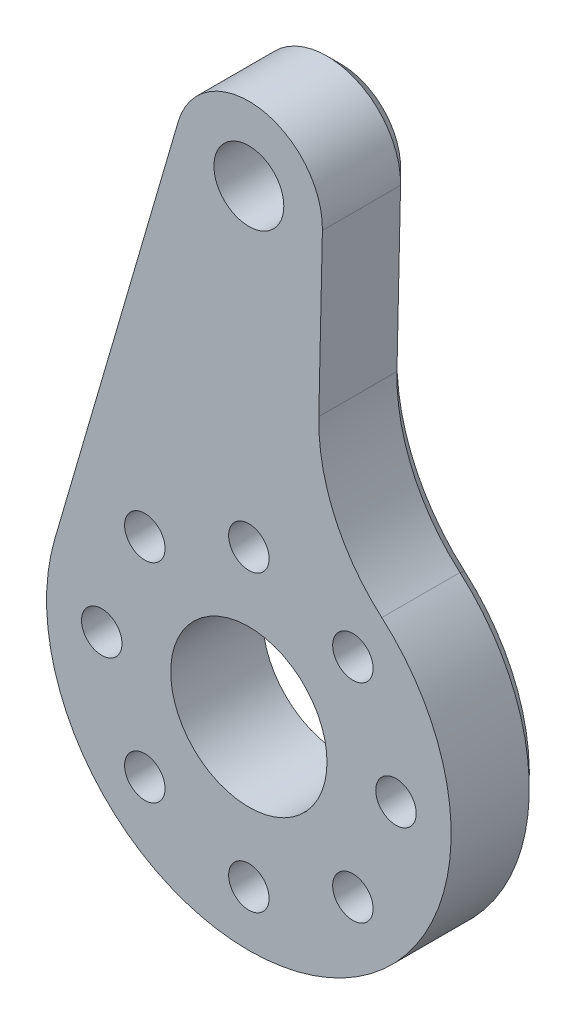
ISO-10303-21;
HEADER;
FILE_DESCRIPTION(('STEP AP214'),'2;1');
FILE_NAME('part.step','',(''),(''),'','','');
FILE_SCHEMA(('AUTOMOTIVE_DESIGN { 1 0 10303 214 1 1 1 1 }'));
ENDSEC;
DATA;
#1=APPLICATION_CONTEXT('core data for automotive mechanical design processes');
#2=APPLICATION_PROTOCOL_DEFINITION('international standard','automotive_design',2000,#1);
#3=PRODUCT_CONTEXT('',#1,'mechanical');
#4=PRODUCT('Part','Part','',(#3));
#5=PRODUCT_RELATED_PRODUCT_CATEGORY('part','',(#4));
#6=PRODUCT_DEFINITION_FORMATION('','',#4);
#7=PRODUCT_DEFINITION_CONTEXT('part definition',#1,'design');
#8=PRODUCT_DEFINITION('design','',#6,#7);
#9=PRODUCT_DEFINITION_SHAPE('','',#8);
#10=(LENGTH_UNIT() NAMED_UNIT(*) SI_UNIT(.MILLI.,.METRE.));
#11=(NAMED_UNIT(*) PLANE_ANGLE_UNIT() SI_UNIT($,.RADIAN.));
#12=(NAMED_UNIT(*) SI_UNIT($,.STERADIAN.) SOLID_ANGLE_UNIT());
#13=UNCERTAINTY_MEASURE_WITH_UNIT(LENGTH_MEASURE(1.E-05),#10,'distance_accuracy_value','');
#14=(GEOMETRIC_REPRESENTATION_CONTEXT(3) GLOBAL_UNCERTAINTY_ASSIGNED_CONTEXT((#13)) GLOBAL_UNIT_ASSIGNED_CONTEXT((#10,
#11,#12)) REPRESENTATION_CONTEXT('',''));
#15=CARTESIAN_POINT('',(0.,0.,0.));
#16=DIRECTION('',(0.,0.,1.));
#17=DIRECTION('',(1.,0.,0.));
#18=AXIS2_PLACEMENT_3D('',#15,#16,#17);
#19=CARTESIAN_POINT('',(-6.71811127656901,-21.5039036018759,5.));
#20=DIRECTION('',(0.,0.,-1.));
#21=DIRECTION('',(-1.,0.,0.));
#22=AXIS2_PLACEMENT_3D('',#19,#20,#21);
#23=CYLINDRICAL_SURFACE('',#22,1.1);
#24=CARTESIAN_POINT('',(-6.71811127656901,-21.5039036018759,5.));
#25=DIRECTION('',(0.,0.,1.));
#26=DIRECTION('',(1.,0.,0.));
#27=AXIS2_PLACEMENT_3D('',#24,#25,#26);
#28=CIRCLE('',#27,1.1);
#29=CARTESIAN_POINT('',(-5.61811127656901,-21.5039036018759,5.));
#30=VERTEX_POINT('',#29);
#31=EDGE_CURVE('E229',#30,#30,#28,.T.);
#32=ORIENTED_EDGE('',*,*,#31,.T.);
#33=EDGE_LOOP('',(#32));
#34=FACE_BOUND('',#33,.T.);
#35=CARTESIAN_POINT('',(-6.71811127656901,-21.5039036018759,2.25));
#36=DIRECTION('',(0.,0.,-1.));
#37=DIRECTION('',(-1.,0.,0.));
#38=AXIS2_PLACEMENT_3D('',#35,#36,#37);
#39=CIRCLE('',#38,1.1);
#40=CARTESIAN_POINT('',(-7.81811127656901,-21.5039036018759,2.25));
#41=VERTEX_POINT('',#40);
#42=EDGE_CURVE('E205',#41,#41,#39,.T.);
#43=ORIENTED_EDGE('',*,*,#42,.T.);
#44=EDGE_LOOP('',(#43));
#45=FACE_BOUND('',#44,.T.);
#46=ADVANCED_FACE('F41',(#34,#45),#23,.F.);
#47=CARTESIAN_POINT('',(-9.06125702707663,-27.1607578513683,5.));
#48=DIRECTION('',(0.,0.,-1.));
#49=DIRECTION('',(-1.,0.,0.));
#50=AXIS2_PLACEMENT_3D('',#47,#48,#49);
#51=CYLINDRICAL_SURFACE('',#50,1.1);
#52=CARTESIAN_POINT('',(-9.06125702707663,-27.1607578513683,5.));
#53=DIRECTION('',(0.,0.,1.));
#54=DIRECTION('',(1.,0.,0.));
#55=AXIS2_PLACEMENT_3D('',#52,#53,#54);
#56=CIRCLE('',#55,1.1);
#57=CARTESIAN_POINT('',(-7.96125702707663,-27.1607578513683,5.));
#58=VERTEX_POINT('',#57);
#59=EDGE_CURVE('E225',#58,#58,#56,.T.);
#60=ORIENTED_EDGE('',*,*,#59,.T.);
#61=EDGE_LOOP('',(#60));
#62=FACE_BOUND('',#61,.T.);
#63=CARTESIAN_POINT('',(-9.06125702707663,-27.1607578513683,2.25));
#64=DIRECTION('',(0.,0.,-1.));
#65=DIRECTION('',(-1.,0.,0.));
#66=AXIS2_PLACEMENT_3D('',#63,#64,#65);
#67=CIRCLE('',#66,1.1);
#68=CARTESIAN_POINT('',(-10.1612570270766,-27.1607578513683,2.25));
#69=VERTEX_POINT('',#68);
#70=EDGE_CURVE('E282',#69,#69,#67,.T.);
#71=ORIENTED_EDGE('',*,*,#70,.T.);
#72=EDGE_LOOP('',(#71));
#73=FACE_BOUND('',#72,.T.);
#74=ADVANCED_FACE('F404',(#62,#73),#51,.F.);
#75=CARTESIAN_POINT('',(-14.718111276569,-29.5039036018759,5.));
#76=DIRECTION('',(0.,0.,-1.));
#77=DIRECTION('',(-1.,0.,0.));
#78=AXIS2_PLACEMENT_3D('',#75,#76,#77);
#79=CYLINDRICAL_SURFACE('',#78,1.1);
#80=CARTESIAN_POINT('',(-14.718111276569,-29.5039036018759,5.));
#81=DIRECTION('',(0.,0.,1.));
#82=DIRECTION('',(1.,0.,0.));
#83=AXIS2_PLACEMENT_3D('',#80,#81,#82);
#84=CIRCLE('',#83,1.1);
#85=CARTESIAN_POINT('',(-13.618111276569,-29.5039036018759,5.));
#86=VERTEX_POINT('',#85);
#87=EDGE_CURVE('E221',#86,#86,#84,.T.);
#88=ORIENTED_EDGE('',*,*,#87,.T.);
#89=EDGE_LOOP('',(#88));
#90=FACE_BOUND('',#89,.T.);
#91=CARTESIAN_POINT('',(-14.718111276569,-29.5039036018759,2.25));
#92=DIRECTION('',(0.,0.,-1.));
#93=DIRECTION('',(-1.,0.,0.));
#94=AXIS2_PLACEMENT_3D('',#91,#92,#93);
#95=CIRCLE('',#94,1.1);
#96=CARTESIAN_POINT('',(-15.818111276569,-29.5039036018759,2.25));
#97=VERTEX_POINT('',#96);
#98=EDGE_CURVE('E278',#97,#97,#95,.T.);
#99=ORIENTED_EDGE('',*,*,#98,.T.);
#100=EDGE_LOOP('',(#99));
#101=FACE_BOUND('',#100,.T.);
#102=ADVANCED_FACE('F409',(#90,#101),#79,.F.);
#103=CARTESIAN_POINT('',(-20.3749655260614,-27.1607578513683,5.));
#104=DIRECTION('',(0.,0.,-1.));
#105=DIRECTION('',(-1.,0.,0.));
#106=AXIS2_PLACEMENT_3D('',#103,#104,#105);
#107=CYLINDRICAL_SURFACE('',#106,1.1);
#108=CARTESIAN_POINT('',(-20.3749655260614,-27.1607578513683,5.));
#109=DIRECTION('',(0.,0.,1.));
#110=DIRECTION('',(1.,0.,0.));
#111=AXIS2_PLACEMENT_3D('',#108,#109,#110);
#112=CIRCLE('',#111,1.1);
#113=CARTESIAN_POINT('',(-19.2749655260614,-27.1607578513683,5.));
#114=VERTEX_POINT('',#113);
#115=EDGE_CURVE('E217',#114,#114,#112,.T.);
#116=ORIENTED_EDGE('',*,*,#115,.T.);
#117=EDGE_LOOP('',(#116));
#118=FACE_BOUND('',#117,.T.);
#119=CARTESIAN_POINT('',(-20.3749655260614,-27.1607578513683,2.25));
#120=DIRECTION('',(0.,0.,-1.));
#121=DIRECTION('',(-1.,0.,0.));
#122=AXIS2_PLACEMENT_3D('',#119,#120,#121);
#123=CIRCLE('',#122,1.1);
#124=CARTESIAN_POINT('',(-21.4749655260614,-27.1607578513683,2.25));
#125=VERTEX_POINT('',#124);
#126=EDGE_CURVE('E274',#125,#125,#123,.T.);
#127=ORIENTED_EDGE('',*,*,#126,.T.);
#128=EDGE_LOOP('',(#127));
#129=FACE_BOUND('',#128,.T.);
#130=ADVANCED_FACE('F416',(#118,#129),#107,.F.);
#131=CARTESIAN_POINT('',(-22.718111276569,-21.5039036018759,5.));
#132=DIRECTION('',(0.,0.,-1.));
#133=DIRECTION('',(-1.,0.,0.));
#134=AXIS2_PLACEMENT_3D('',#131,#132,#133);
#135=CYLINDRICAL_SURFACE('',#134,1.1);
#136=CARTESIAN_POINT('',(-22.718111276569,-21.5039036018759,5.));
#137=DIRECTION('',(0.,0.,1.));
#138=DIRECTION('',(1.,0.,0.));
#139=AXIS2_PLACEMENT_3D('',#136,#137,#138);
#140=CIRCLE('',#139,1.1);
#141=CARTESIAN_POINT('',(-21.618111276569,-21.5039036018759,5.));
#142=VERTEX_POINT('',#141);
#143=EDGE_CURVE('E213',#142,#142,#140,.T.);
#144=ORIENTED_EDGE('',*,*,#143,.T.);
#145=EDGE_LOOP('',(#144));
#146=FACE_BOUND('',#145,.T.);
#147=CARTESIAN_POINT('',(-22.718111276569,-21.5039036018759,2.25));
#148=DIRECTION('',(0.,0.,-1.));
#149=DIRECTION('',(-1.,0.,0.));
#150=AXIS2_PLACEMENT_3D('',#147,#148,#149);
#151=CIRCLE('',#150,1.1);
#152=CARTESIAN_POINT('',(-23.818111276569,-21.5039036018759,2.25));
#153=VERTEX_POINT('',#152);
#154=EDGE_CURVE('E270',#153,#153,#151,.T.);
#155=ORIENTED_EDGE('',*,*,#154,.T.);
#156=EDGE_LOOP('',(#155));
#157=FACE_BOUND('',#156,.T.);
#158=ADVANCED_FACE('F420',(#146,#157),#135,.F.);
#159=CARTESIAN_POINT('',(-20.3749655260614,-15.8470493523836,5.));
#160=DIRECTION('',(0.,0.,-1.));
#161=DIRECTION('',(-1.,0.,0.));
#162=AXIS2_PLACEMENT_3D('',#159,#160,#161);
#163=CYLINDRICAL_SURFACE('',#162,1.1);
#164=CARTESIAN_POINT('',(-20.3749655260614,-15.8470493523836,5.));
#165=DIRECTION('',(0.,0.,1.));
#166=DIRECTION('',(1.,0.,0.));
#167=AXIS2_PLACEMENT_3D('',#164,#165,#166);
#168=CIRCLE('',#167,1.1);
#169=CARTESIAN_POINT('',(-19.2749655260614,-15.8470493523836,5.));
#170=VERTEX_POINT('',#169);
#171=EDGE_CURVE('E209',#170,#170,#168,.T.);
#172=ORIENTED_EDGE('',*,*,#171,.T.);
#173=EDGE_LOOP('',(#172));
#174=FACE_BOUND('',#173,.T.);
#175=CARTESIAN_POINT('',(-20.3749655260614,-15.8470493523836,2.25));
#176=DIRECTION('',(0.,0.,-1.));
#177=DIRECTION('',(-1.,0.,0.));
#178=AXIS2_PLACEMENT_3D('',#175,#176,#177);
#179=CIRCLE('',#178,1.1);
#180=CARTESIAN_POINT('',(-21.4749655260614,-15.8470493523836,2.25));
#181=VERTEX_POINT('',#180);
#182=EDGE_CURVE('E266',#181,#181,#179,.T.);
#183=ORIENTED_EDGE('',*,*,#182,.T.);
#184=EDGE_LOOP('',(#183));
#185=FACE_BOUND('',#184,.T.);
#186=ADVANCED_FACE('F424',(#174,#185),#163,.F.);
#187=CARTESIAN_POINT('',(-14.718111276569,-13.5039036018759,5.));
#188=DIRECTION('',(0.,0.,-1.));
#189=DIRECTION('',(-1.,0.,0.));
#190=AXIS2_PLACEMENT_3D('',#187,#188,#189);
#191=CYLINDRICAL_SURFACE('',#190,1.1);
#192=CARTESIAN_POINT('',(-14.718111276569,-13.5039036018759,5.));
#193=DIRECTION('',(0.,0.,1.));
#194=DIRECTION('',(1.,0.,0.));
#195=AXIS2_PLACEMENT_3D('',#192,#193,#194);
#196=CIRCLE('',#195,1.1);
#197=CARTESIAN_POINT('',(-13.618111276569,-13.5039036018759,5.));
#198=VERTEX_POINT('',#197);
#199=EDGE_CURVE('E204',#198,#198,#196,.T.);
#200=ORIENTED_EDGE('',*,*,#199,.T.);
#201=EDGE_LOOP('',(#200));
#202=FACE_BOUND('',#201,.T.);
#203=CARTESIAN_POINT('',(-14.718111276569,-13.5039036018759,2.25));
#204=DIRECTION('',(0.,0.,-1.));
#205=DIRECTION('',(-1.,0.,0.));
#206=AXIS2_PLACEMENT_3D('',#203,#204,#205);
#207=CIRCLE('',#206,1.1);
#208=CARTESIAN_POINT('',(-15.818111276569,-13.5039036018759,2.25));
#209=VERTEX_POINT('',#208);
#210=EDGE_CURVE('E262',#209,#209,#207,.T.);
#211=ORIENTED_EDGE('',*,*,#210,.T.);
#212=EDGE_LOOP('',(#211));
#213=FACE_BOUND('',#212,.T.);
#214=ADVANCED_FACE('F428',(#202,#213),#191,.F.);
#215=CARTESIAN_POINT('',(-9.06125702707664,-15.8470493523836,5.));
#216=DIRECTION('',(0.,0.,-1.));
#217=DIRECTION('',(-1.,0.,0.));
#218=AXIS2_PLACEMENT_3D('',#215,#216,#217);
#219=CYLINDRICAL_SURFACE('',#218,1.1);
#220=CARTESIAN_POINT('',(-9.06125702707664,-15.8470493523836,5.));
#221=DIRECTION('',(0.,0.,1.));
#222=DIRECTION('',(1.,0.,0.));
#223=AXIS2_PLACEMENT_3D('',#220,#221,#222);
#224=CIRCLE('',#223,1.1);
#225=CARTESIAN_POINT('',(-7.96125702707664,-15.8470493523836,5.));
#226=VERTEX_POINT('',#225);
#227=EDGE_CURVE('E200',#226,#226,#224,.T.);
#228=ORIENTED_EDGE('',*,*,#227,.T.);
#229=EDGE_LOOP('',(#228));
#230=FACE_BOUND('',#229,.T.);
#231=CARTESIAN_POINT('',(-9.06125702707664,-15.8470493523836,2.25));
#232=DIRECTION('',(0.,0.,-1.));
#233=DIRECTION('',(-1.,0.,0.));
#234=AXIS2_PLACEMENT_3D('',#231,#232,#233);
#235=CIRCLE('',#234,1.1);
#236=CARTESIAN_POINT('',(-10.1612570270766,-15.8470493523836,2.25));
#237=VERTEX_POINT('',#236);
#238=EDGE_CURVE('E196',#237,#237,#235,.T.);
#239=ORIENTED_EDGE('',*,*,#238,.T.);
#240=EDGE_LOOP('',(#239));
#241=FACE_BOUND('',#240,.T.);
#242=ADVANCED_FACE('F432',(#230,#241),#219,.F.);
#243=CARTESIAN_POINT('',(-14.718111276569,3.49609639812407,5.));
#244=DIRECTION('',(0.,0.,1.));
#245=DIRECTION('',(1.,0.,0.));
#246=AXIS2_PLACEMENT_3D('',#243,#244,#245);
#247=PLANE('',#246);
#248=DIRECTION('',(-0.0219929480625186,-0.999758125866211,0.));
#249=VECTOR('',#248,1.);
#250=CARTESIAN_POINT('',(-10.7190787731042,3.40812460587399,5.));
#251=LINE('',#250,#249);
#252=CARTESIAN_POINT('',(-10.7190787731042,3.40812460587399,5.));
#253=VERTEX_POINT('',#252);
#254=CARTESIAN_POINT('',(-10.9140806022467,-5.45629241952004,5.));
#255=VERTEX_POINT('',#254);
#256=EDGE_CURVE('E121',#253,#255,#251,.T.);
#257=ORIENTED_EDGE('',*,*,#256,.F.);
#258=CARTESIAN_POINT('',(-14.718111276569,3.49609639812407,5.));
#259=DIRECTION('',(0.,0.,1.));
#260=DIRECTION('',(1.,0.,0.));
#261=AXIS2_PLACEMENT_3D('',#258,#259,#260);
#262=CIRCLE('',#261,4.);
#263=CARTESIAN_POINT('',(-18.558111276569,4.61609639812407,5.));
#264=VERTEX_POINT('',#263);
#265=EDGE_CURVE('E105',#253,#264,#262,.T.);
#266=ORIENTED_EDGE('',*,*,#265,.T.);
#267=DIRECTION('',(-0.28,-0.96,0.));
#268=VECTOR('',#267,1.);
#269=CARTESIAN_POINT('',(-18.558111276569,4.61609639812407,5.));
#270=LINE('',#269,#268);
#271=CARTESIAN_POINT('',(-25.278111276569,-18.4239036018759,5.));
#272=VERTEX_POINT('',#271);
#273=EDGE_CURVE('E113',#264,#272,#270,.T.);
#274=ORIENTED_EDGE('',*,*,#273,.T.);
#275=CARTESIAN_POINT('',(-14.718111276569,-21.5039036018759,5.));
#276=DIRECTION('',(0.,0.,1.));
#277=DIRECTION('',(1.,0.,0.));
#278=AXIS2_PLACEMENT_3D('',#275,#276,#277);
#279=CIRCLE('',#278,11.);
#280=CARTESIAN_POINT('',(-7.48869550214859,-13.2132131866837,5.));
#281=VERTEX_POINT('',#280);
#282=EDGE_CURVE('E250',#272,#281,#279,.T.);
#283=ORIENTED_EDGE('',*,*,#282,.T.);
#284=CARTESIAN_POINT('',(-0.916499343584562,-5.67622190014523,5.));
#285=DIRECTION('',(0.,0.,1.));
#286=DIRECTION('',(1.,0.,0.));
#287=AXIS2_PLACEMENT_3D('',#284,#285,#286);
#288=CIRCLE('',#287,10.);
#289=EDGE_CURVE('E131',#281,#255,#288,.F.);
#290=ORIENTED_EDGE('',*,*,#289,.T.);
#291=EDGE_LOOP('',(#257,#266,#274,#283,#290));
#292=FACE_BOUND('',#291,.T.);
#293=ORIENTED_EDGE('',*,*,#199,.F.);
#294=EDGE_LOOP('',(#293));
#295=FACE_BOUND('',#294,.T.);
#296=ORIENTED_EDGE('',*,*,#143,.F.);
#297=EDGE_LOOP('',(#296));
#298=FACE_BOUND('',#297,.T.);
#299=ORIENTED_EDGE('',*,*,#87,.F.);
#300=EDGE_LOOP('',(#299));
#301=FACE_BOUND('',#300,.T.);
#302=ORIENTED_EDGE('',*,*,#31,.F.);
#303=EDGE_LOOP('',(#302));
#304=FACE_BOUND('',#303,.T.);
#305=CARTESIAN_POINT('',(-14.718111276569,3.49609639812407,5.));
#306=DIRECTION('',(0.,0.,1.));
#307=DIRECTION('',(1.,0.,0.));
#308=AXIS2_PLACEMENT_3D('',#305,#306,#307);
#309=CIRCLE('',#308,1.9);
#310=CARTESIAN_POINT('',(-12.818111276569,3.49609639812407,5.));
#311=VERTEX_POINT('',#310);
#312=EDGE_CURVE('E114',#311,#311,#309,.T.);
#313=ORIENTED_EDGE('',*,*,#312,.F.);
#314=EDGE_LOOP('',(#313));
#315=FACE_BOUND('',#314,.T.);
#316=CARTESIAN_POINT('',(-14.718111276569,-21.5039036018759,5.));
#317=DIRECTION('',(0.,0.,1.));
#318=DIRECTION('',(1.,0.,0.));
#319=AXIS2_PLACEMENT_3D('',#316,#317,#318);
#320=CIRCLE('',#319,4.25);
#321=CARTESIAN_POINT('',(-10.468111276569,-21.5039036018759,5.));
#322=VERTEX_POINT('',#321);
#323=EDGE_CURVE('E234',#322,#322,#320,.T.);
#324=ORIENTED_EDGE('',*,*,#323,.F.);
#325=EDGE_LOOP('',(#324));
#326=FACE_BOUND('',#325,.T.);
#327=ORIENTED_EDGE('',*,*,#59,.F.);
#328=EDGE_LOOP('',(#327));
#329=FACE_BOUND('',#328,.T.);
#330=ORIENTED_EDGE('',*,*,#115,.F.);
#331=EDGE_LOOP('',(#330));
#332=FACE_BOUND('',#331,.T.);
#333=ORIENTED_EDGE('',*,*,#171,.F.);
#334=EDGE_LOOP('',(#333));
#335=FACE_BOUND('',#334,.T.);
#336=ORIENTED_EDGE('',*,*,#227,.F.);
#337=EDGE_LOOP('',(#336));
#338=FACE_BOUND('',#337,.T.);
#339=ADVANCED_FACE('F127',(#292,#295,#298,#301,#304,#315,#326,#329,#332,#335,#338),#247,.T.);
#340=CARTESIAN_POINT('',(-14.718111276569,3.49609639812407,0.));
#341=DIRECTION('',(0.,0.,1.));
#342=DIRECTION('',(1.,0.,0.));
#343=AXIS2_PLACEMENT_3D('',#340,#341,#342);
#344=PLANE('',#343);
#345=CARTESIAN_POINT('',(-14.718111276569,3.49609639812407,0.));
#346=DIRECTION('',(0.,0.,1.));
#347=DIRECTION('',(1.,0.,0.));
#348=AXIS2_PLACEMENT_3D('',#345,#346,#347);
#349=CIRCLE('',#348,3.25);
#350=CARTESIAN_POINT('',(-17.838111276569,4.40609639812407,0.));
#351=VERTEX_POINT('',#350);
#352=CARTESIAN_POINT('',(-11.4688973675038,3.42461931692088,0.));
#353=VERTEX_POINT('',#352);
#354=EDGE_CURVE('E304',#351,#353,#349,.F.);
#355=ORIENTED_EDGE('',*,*,#354,.T.);
#356=DIRECTION('',(-0.0219929480625186,-0.999758125866211,0.));
#357=VECTOR('',#356,1.);
#358=CARTESIAN_POINT('',(-11.4688973675038,3.42461931692088,0.));
#359=LINE('',#358,#357);
#360=CARTESIAN_POINT('',(-11.6638991966463,-5.43979770847315,0.));
#361=VERTEX_POINT('',#360);
#362=EDGE_CURVE('E310',#353,#361,#359,.T.);
#363=ORIENTED_EDGE('',*,*,#362,.T.);
#364=CARTESIAN_POINT('',(-0.916499343584562,-5.67622190014523,0.));
#365=DIRECTION('',(0.,0.,1.));
#366=DIRECTION('',(1.,0.,0.));
#367=AXIS2_PLACEMENT_3D('',#364,#365,#366);
#368=CIRCLE('',#367,10.75);
#369=CARTESIAN_POINT('',(-7.98161021404089,-13.778487533174,0.));
#370=VERTEX_POINT('',#369);
#371=EDGE_CURVE('E307',#361,#370,#368,.T.);
#372=ORIENTED_EDGE('',*,*,#371,.T.);
#373=CARTESIAN_POINT('',(-14.718111276569,-21.5039036018759,0.));
#374=DIRECTION('',(0.,0.,1.));
#375=DIRECTION('',(1.,0.,0.));
#376=AXIS2_PLACEMENT_3D('',#373,#374,#375);
#377=CIRCLE('',#376,10.25);
#378=CARTESIAN_POINT('',(-24.558111276569,-18.6339036018759,0.));
#379=VERTEX_POINT('',#378);
#380=EDGE_CURVE('E301',#370,#379,#377,.F.);
#381=ORIENTED_EDGE('',*,*,#380,.T.);
#382=DIRECTION('',(0.28,0.96,0.));
#383=VECTOR('',#382,1.);
#384=CARTESIAN_POINT('',(-17.838111276569,4.40609639812407,0.));
#385=LINE('',#384,#383);
#386=EDGE_CURVE('E298',#379,#351,#385,.T.);
#387=ORIENTED_EDGE('',*,*,#386,.T.);
#388=EDGE_LOOP('',(#355,#363,#372,#381,#387));
#389=FACE_BOUND('',#388,.T.);
#390=CARTESIAN_POINT('',(-20.3749655260614,-15.8470493523836,0.));
#391=DIRECTION('',(0.,0.,-1.));
#392=DIRECTION('',(-1.,0.,0.));
#393=AXIS2_PLACEMENT_3D('',#390,#391,#392);
#394=CIRCLE('',#393,1.75);
#395=CARTESIAN_POINT('',(-22.1249655260614,-15.8470493523836,0.));
#396=VERTEX_POINT('',#395);
#397=EDGE_CURVE('E133',#396,#396,#394,.T.);
#398=ORIENTED_EDGE('',*,*,#397,.F.);
#399=EDGE_LOOP('',(#398));
#400=FACE_BOUND('',#399,.T.);
#401=CARTESIAN_POINT('',(-14.718111276569,-13.5039036018759,0.));
#402=DIRECTION('',(0.,0.,-1.));
#403=DIRECTION('',(-1.,0.,0.));
#404=AXIS2_PLACEMENT_3D('',#401,#402,#403);
#405=CIRCLE('',#404,1.75);
#406=CARTESIAN_POINT('',(-16.468111276569,-13.5039036018759,0.));
#407=VERTEX_POINT('',#406);
#408=EDGE_CURVE('E185',#407,#407,#405,.T.);
#409=ORIENTED_EDGE('',*,*,#408,.F.);
#410=EDGE_LOOP('',(#409));
#411=FACE_BOUND('',#410,.T.);
#412=CARTESIAN_POINT('',(-9.06125702707664,-15.8470493523836,0.));
#413=DIRECTION('',(0.,0.,-1.));
#414=DIRECTION('',(-1.,0.,0.));
#415=AXIS2_PLACEMENT_3D('',#412,#413,#414);
#416=CIRCLE('',#415,1.75);
#417=CARTESIAN_POINT('',(-10.8112570270766,-15.8470493523836,0.));
#418=VERTEX_POINT('',#417);
#419=EDGE_CURVE('E177',#418,#418,#416,.T.);
#420=ORIENTED_EDGE('',*,*,#419,.F.);
#421=EDGE_LOOP('',(#420));
#422=FACE_BOUND('',#421,.T.);
#423=CARTESIAN_POINT('',(-6.71811127656902,-21.5039036018759,0.));
#424=DIRECTION('',(0.,0.,-1.));
#425=DIRECTION('',(-1.,0.,0.));
#426=AXIS2_PLACEMENT_3D('',#423,#424,#425);
#427=CIRCLE('',#426,1.75);
#428=CARTESIAN_POINT('',(-8.46811127656902,-21.5039036018759,0.));
#429=VERTEX_POINT('',#428);
#430=EDGE_CURVE('E169',#429,#429,#427,.T.);
#431=ORIENTED_EDGE('',*,*,#430,.F.);
#432=EDGE_LOOP('',(#431));
#433=FACE_BOUND('',#432,.T.);
#434=CARTESIAN_POINT('',(-9.06125702707664,-27.1607578513683,0.));
#435=DIRECTION('',(0.,0.,-1.));
#436=DIRECTION('',(-1.,0.,0.));
#437=AXIS2_PLACEMENT_3D('',#434,#435,#436);
#438=CIRCLE('',#437,1.75);
#439=CARTESIAN_POINT('',(-10.8112570270766,-27.1607578513683,0.));
#440=VERTEX_POINT('',#439);
#441=EDGE_CURVE('E161',#440,#440,#438,.T.);
#442=ORIENTED_EDGE('',*,*,#441,.F.);
#443=EDGE_LOOP('',(#442));
#444=FACE_BOUND('',#443,.T.);
#445=CARTESIAN_POINT('',(-14.718111276569,-29.5039036018759,0.));
#446=DIRECTION('',(0.,0.,-1.));
#447=DIRECTION('',(-1.,0.,0.));
#448=AXIS2_PLACEMENT_3D('',#445,#446,#447);
#449=CIRCLE('',#448,1.75);
#450=CARTESIAN_POINT('',(-16.468111276569,-29.5039036018759,0.));
#451=VERTEX_POINT('',#450);
#452=EDGE_CURVE('E153',#451,#451,#449,.T.);
#453=ORIENTED_EDGE('',*,*,#452,.F.);
#454=EDGE_LOOP('',(#453));
#455=FACE_BOUND('',#454,.T.);
#456=CARTESIAN_POINT('',(-20.3749655260614,-27.1607578513683,0.));
#457=DIRECTION('',(0.,0.,-1.));
#458=DIRECTION('',(-1.,0.,0.));
#459=AXIS2_PLACEMENT_3D('',#456,#457,#458);
#460=CIRCLE('',#459,1.74999999999999);
#461=CARTESIAN_POINT('',(-22.1249655260614,-27.1607578513683,0.));
#462=VERTEX_POINT('',#461);
#463=EDGE_CURVE('E145',#462,#462,#460,.T.);
#464=ORIENTED_EDGE('',*,*,#463,.F.);
#465=EDGE_LOOP('',(#464));
#466=FACE_BOUND('',#465,.T.);
#467=CARTESIAN_POINT('',(-22.718111276569,-21.5039036018759,0.));
#468=DIRECTION('',(0.,0.,-1.));
#469=DIRECTION('',(-1.,0.,0.));
#470=AXIS2_PLACEMENT_3D('',#467,#468,#469);
#471=CIRCLE('',#470,1.75);
#472=CARTESIAN_POINT('',(-24.468111276569,-21.5039036018759,0.));
#473=VERTEX_POINT('',#472);
#474=EDGE_CURVE('E144',#473,#473,#471,.T.);
#475=ORIENTED_EDGE('',*,*,#474,.F.);
#476=EDGE_LOOP('',(#475));
#477=FACE_BOUND('',#476,.T.);
#478=CARTESIAN_POINT('',(-14.718111276569,3.49609639812407,0.));
#479=DIRECTION('',(0.,0.,1.));
#480=DIRECTION('',(1.,0.,0.));
#481=AXIS2_PLACEMENT_3D('',#478,#479,#480);
#482=CIRCLE('',#481,1.9);
#483=CARTESIAN_POINT('',(-12.818111276569,3.49609639812407,0.));
#484=VERTEX_POINT('',#483);
#485=EDGE_CURVE('E238',#484,#484,#482,.T.);
#486=ORIENTED_EDGE('',*,*,#485,.T.);
#487=EDGE_LOOP('',(#486));
#488=FACE_BOUND('',#487,.T.);
#489=CARTESIAN_POINT('',(-14.718111276569,-21.5039036018759,0.));
#490=DIRECTION('',(0.,0.,1.));
#491=DIRECTION('',(1.,0.,0.));
#492=AXIS2_PLACEMENT_3D('',#489,#490,#491);
#493=CIRCLE('',#492,4.25);
#494=CARTESIAN_POINT('',(-10.468111276569,-21.5039036018759,0.));
#495=VERTEX_POINT('',#494);
#496=EDGE_CURVE('E233',#495,#495,#493,.T.);
#497=ORIENTED_EDGE('',*,*,#496,.T.);
#498=EDGE_LOOP('',(#497));
#499=FACE_BOUND('',#498,.T.);
#500=ADVANCED_FACE('F363',(#389,#400,#411,#422,#433,#444,#455,#466,#477,#488,#499),#344,.F.);
#501=CARTESIAN_POINT('',(-14.718111276569,3.49609639812407,5.));
#502=DIRECTION('',(0.,0.,-1.));
#503=DIRECTION('',(-1.,0.,0.));
#504=AXIS2_PLACEMENT_3D('',#501,#502,#503);
#505=CYLINDRICAL_SURFACE('',#504,4.);
#506=DIRECTION('',(0.,0.,-1.));
#507=VECTOR('',#506,1.);
#508=CARTESIAN_POINT('',(-10.7190787731042,3.40812460587399,10.));
#509=LINE('',#508,#507);
#510=CARTESIAN_POINT('',(-10.7190787731042,3.40812460587399,0.750000000000001));
#511=VERTEX_POINT('',#510);
#512=EDGE_CURVE('E108',#253,#511,#509,.T.);
#513=ORIENTED_EDGE('',*,*,#512,.T.);
#514=CARTESIAN_POINT('',(-14.718111276569,3.49609639812407,0.750000000000001));
#515=DIRECTION('',(0.,0.,1.));
#516=DIRECTION('',(1.,0.,0.));
#517=AXIS2_PLACEMENT_3D('',#514,#515,#516);
#518=CIRCLE('',#517,4.);
#519=CARTESIAN_POINT('',(-18.558111276569,4.61609639812407,0.750000000000001));
#520=VERTEX_POINT('',#519);
#521=EDGE_CURVE('E65',#511,#520,#518,.T.);
#522=ORIENTED_EDGE('',*,*,#521,.T.);
#523=DIRECTION('',(0.,0.,-1.));
#524=VECTOR('',#523,1.);
#525=CARTESIAN_POINT('',(-18.558111276569,4.61609639812407,5.));
#526=LINE('',#525,#524);
#527=EDGE_CURVE('E109',#264,#520,#526,.T.);
#528=ORIENTED_EDGE('',*,*,#527,.F.);
#529=ORIENTED_EDGE('',*,*,#265,.F.);
#530=EDGE_LOOP('',(#513,#522,#528,#529));
#531=FACE_BOUND('',#530,.T.);
#532=ADVANCED_FACE('F107',(#531),#505,.T.);
#533=CARTESIAN_POINT('',(-18.558111276569,4.61609639812407,5.));
#534=DIRECTION('',(0.96,-0.28,0.));
#535=DIRECTION('',(0.28,0.96,0.));
#536=AXIS2_PLACEMENT_3D('',#533,#534,#535);
#537=PLANE('',#536);
#538=ORIENTED_EDGE('',*,*,#527,.T.);
#539=DIRECTION('',(-0.28,-0.96,0.));
#540=VECTOR('',#539,1.);
#541=CARTESIAN_POINT('',(-18.558111276569,4.61609639812407,0.750000000000001));
#542=LINE('',#541,#540);
#543=CARTESIAN_POINT('',(-25.278111276569,-18.4239036018759,0.750000000000001));
#544=VERTEX_POINT('',#543);
#545=EDGE_CURVE('E11',#520,#544,#542,.T.);
#546=ORIENTED_EDGE('',*,*,#545,.T.);
#547=DIRECTION('',(0.,0.,-1.));
#548=VECTOR('',#547,1.);
#549=CARTESIAN_POINT('',(-25.278111276569,-18.4239036018759,5.));
#550=LINE('',#549,#548);
#551=EDGE_CURVE('E253',#272,#544,#550,.T.);
#552=ORIENTED_EDGE('',*,*,#551,.F.);
#553=ORIENTED_EDGE('',*,*,#273,.F.);
#554=EDGE_LOOP('',(#538,#546,#552,#553));
#555=FACE_BOUND('',#554,.T.);
#556=ADVANCED_FACE('F558',(#555),#537,.F.);
#557=CARTESIAN_POINT('',(-14.718111276569,-21.5039036018759,5.));
#558=DIRECTION('',(0.,0.,-1.));
#559=DIRECTION('',(-1.,0.,0.));
#560=AXIS2_PLACEMENT_3D('',#557,#558,#559);
#561=CYLINDRICAL_SURFACE('',#560,11.);
#562=ORIENTED_EDGE('',*,*,#551,.T.);
#563=CARTESIAN_POINT('',(-14.718111276569,-21.5039036018759,0.750000000000001));
#564=DIRECTION('',(0.,0.,1.));
#565=DIRECTION('',(1.,0.,0.));
#566=AXIS2_PLACEMENT_3D('',#563,#564,#565);
#567=CIRCLE('',#566,11.);
#568=CARTESIAN_POINT('',(-7.48869550214859,-13.2132131866837,0.750000000000001));
#569=VERTEX_POINT('',#568);
#570=EDGE_CURVE('E51',#544,#569,#567,.T.);
#571=ORIENTED_EDGE('',*,*,#570,.T.);
#572=DIRECTION('',(0.,0.,-1.));
#573=VECTOR('',#572,1.);
#574=CARTESIAN_POINT('',(-7.48869550214859,-13.2132131866837,5.));
#575=LINE('',#574,#573);
#576=EDGE_CURVE('E291',#569,#281,#575,.F.);
#577=ORIENTED_EDGE('',*,*,#576,.T.);
#578=ORIENTED_EDGE('',*,*,#282,.F.);
#579=EDGE_LOOP('',(#562,#571,#577,#578));
#580=FACE_BOUND('',#579,.T.);
#581=ADVANCED_FACE('F349',(#580),#561,.T.);
#582=CARTESIAN_POINT('',(-14.718111276569,3.49609639812407,5.));
#583=DIRECTION('',(0.,0.,-1.));
#584=DIRECTION('',(-1.,0.,0.));
#585=AXIS2_PLACEMENT_3D('',#582,#583,#584);
#586=CYLINDRICAL_SURFACE('',#585,1.9);
#587=ORIENTED_EDGE('',*,*,#312,.T.);
#588=EDGE_LOOP('',(#587));
#589=FACE_BOUND('',#588,.T.);
#590=ORIENTED_EDGE('',*,*,#485,.F.);
#591=EDGE_LOOP('',(#590));
#592=FACE_BOUND('',#591,.T.);
#593=ADVANCED_FACE('F390',(#589,#592),#586,.F.);
#594=CARTESIAN_POINT('',(-14.718111276569,-21.5039036018759,5.));
#595=DIRECTION('',(0.,0.,-1.));
#596=DIRECTION('',(-1.,0.,0.));
#597=AXIS2_PLACEMENT_3D('',#594,#595,#596);
#598=CYLINDRICAL_SURFACE('',#597,4.25);
#599=ORIENTED_EDGE('',*,*,#323,.T.);
#600=EDGE_LOOP('',(#599));
#601=FACE_BOUND('',#600,.T.);
#602=ORIENTED_EDGE('',*,*,#496,.F.);
#603=EDGE_LOOP('',(#602));
#604=FACE_BOUND('',#603,.T.);
#605=ADVANCED_FACE('F387',(#601,#604),#598,.F.);
#606=CARTESIAN_POINT('',(-9.06125702707664,-15.8470493523836,2.25));
#607=DIRECTION('',(0.,0.,-1.));
#608=DIRECTION('',(-1.,0.,0.));
#609=AXIS2_PLACEMENT_3D('',#606,#607,#608);
#610=CYLINDRICAL_SURFACE('',#609,1.75);
#611=CARTESIAN_POINT('',(-9.06125702707664,-15.8470493523836,2.25));
#612=DIRECTION('',(0.,0.,-1.));
#613=DIRECTION('',(-1.,0.,0.));
#614=AXIS2_PLACEMENT_3D('',#611,#612,#613);
#615=CIRCLE('',#614,1.75);
#616=CARTESIAN_POINT('',(-10.8112570270766,-15.8470493523836,2.25));
#617=VERTEX_POINT('',#616);
#618=EDGE_CURVE('E173',#617,#617,#615,.T.);
#619=ORIENTED_EDGE('',*,*,#618,.F.);
#620=EDGE_LOOP('',(#619));
#621=FACE_BOUND('',#620,.T.);
#622=ORIENTED_EDGE('',*,*,#419,.T.);
#623=EDGE_LOOP('',(#622));
#624=FACE_BOUND('',#623,.T.);
#625=ADVANCED_FACE('F389',(#621,#624),#610,.F.);
#626=CARTESIAN_POINT('',(-9.06125702707664,-15.8470493523836,2.25));
#627=DIRECTION('',(0.,0.,-1.));
#628=DIRECTION('',(-1.,0.,0.));
#629=AXIS2_PLACEMENT_3D('',#626,#627,#628);
#630=PLANE('',#629);
#631=ORIENTED_EDGE('',*,*,#238,.F.);
#632=EDGE_LOOP('',(#631));
#633=FACE_BOUND('',#632,.T.);
#634=ORIENTED_EDGE('',*,*,#618,.T.);
#635=EDGE_LOOP('',(#634));
#636=FACE_BOUND('',#635,.T.);
#637=ADVANCED_FACE('F397',(#633,#636),#630,.T.);
#638=CARTESIAN_POINT('',(-14.718111276569,-13.5039036018759,2.25));
#639=DIRECTION('',(0.,0.,-1.));
#640=DIRECTION('',(-1.,0.,0.));
#641=AXIS2_PLACEMENT_3D('',#638,#639,#640);
#642=CYLINDRICAL_SURFACE('',#641,1.75);
#643=CARTESIAN_POINT('',(-14.718111276569,-13.5039036018759,2.25));
#644=DIRECTION('',(0.,0.,-1.));
#645=DIRECTION('',(-1.,0.,0.));
#646=AXIS2_PLACEMENT_3D('',#643,#644,#645);
#647=CIRCLE('',#646,1.75);
#648=CARTESIAN_POINT('',(-16.468111276569,-13.5039036018759,2.25));
#649=VERTEX_POINT('',#648);
#650=EDGE_CURVE('E181',#649,#649,#647,.T.);
#651=ORIENTED_EDGE('',*,*,#650,.F.);
#652=EDGE_LOOP('',(#651));
#653=FACE_BOUND('',#652,.T.);
#654=ORIENTED_EDGE('',*,*,#408,.T.);
#655=EDGE_LOOP('',(#654));
#656=FACE_BOUND('',#655,.T.);
#657=ADVANCED_FACE('F455',(#653,#656),#642,.F.);
#658=CARTESIAN_POINT('',(-14.718111276569,-13.5039036018759,2.25));
#659=DIRECTION('',(0.,0.,-1.));
#660=DIRECTION('',(-1.,0.,0.));
#661=AXIS2_PLACEMENT_3D('',#658,#659,#660);
#662=PLANE('',#661);
#663=ORIENTED_EDGE('',*,*,#210,.F.);
#664=EDGE_LOOP('',(#663));
#665=FACE_BOUND('',#664,.T.);
#666=ORIENTED_EDGE('',*,*,#650,.T.);
#667=EDGE_LOOP('',(#666));
#668=FACE_BOUND('',#667,.T.);
#669=ADVANCED_FACE('F450',(#665,#668),#662,.T.);
#670=CARTESIAN_POINT('',(-20.3749655260614,-15.8470493523836,2.25));
#671=DIRECTION('',(0.,0.,-1.));
#672=DIRECTION('',(-1.,0.,0.));
#673=AXIS2_PLACEMENT_3D('',#670,#671,#672);
#674=CYLINDRICAL_SURFACE('',#673,1.75);
#675=CARTESIAN_POINT('',(-20.3749655260614,-15.8470493523836,2.25));
#676=DIRECTION('',(0.,0.,-1.));
#677=DIRECTION('',(-1.,0.,0.));
#678=AXIS2_PLACEMENT_3D('',#675,#676,#677);
#679=CIRCLE('',#678,1.75);
#680=CARTESIAN_POINT('',(-22.1249655260614,-15.8470493523836,2.25));
#681=VERTEX_POINT('',#680);
#682=EDGE_CURVE('E137',#681,#681,#679,.T.);
#683=ORIENTED_EDGE('',*,*,#682,.F.);
#684=EDGE_LOOP('',(#683));
#685=FACE_BOUND('',#684,.T.);
#686=ORIENTED_EDGE('',*,*,#397,.T.);
#687=EDGE_LOOP('',(#686));
#688=FACE_BOUND('',#687,.T.);
#689=ADVANCED_FACE('F447',(#685,#688),#674,.F.);
#690=CARTESIAN_POINT('',(-20.3749655260614,-15.8470493523836,2.25));
#691=DIRECTION('',(0.,0.,-1.));
#692=DIRECTION('',(-1.,0.,0.));
#693=AXIS2_PLACEMENT_3D('',#690,#691,#692);
#694=PLANE('',#693);
#695=ORIENTED_EDGE('',*,*,#182,.F.);
#696=EDGE_LOOP('',(#695));
#697=FACE_BOUND('',#696,.T.);
#698=ORIENTED_EDGE('',*,*,#682,.T.);
#699=EDGE_LOOP('',(#698));
#700=FACE_BOUND('',#699,.T.);
#701=ADVANCED_FACE('F441',(#697,#700),#694,.T.);
#702=CARTESIAN_POINT('',(-22.718111276569,-21.5039036018759,2.25));
#703=DIRECTION('',(0.,0.,-1.));
#704=DIRECTION('',(-1.,0.,0.));
#705=AXIS2_PLACEMENT_3D('',#702,#703,#704);
#706=CYLINDRICAL_SURFACE('',#705,1.75);
#707=CARTESIAN_POINT('',(-22.718111276569,-21.5039036018759,2.25));
#708=DIRECTION('',(0.,0.,-1.));
#709=DIRECTION('',(-1.,0.,0.));
#710=AXIS2_PLACEMENT_3D('',#707,#708,#709);
#711=CIRCLE('',#710,1.75);
#712=CARTESIAN_POINT('',(-24.468111276569,-21.5039036018759,2.25));
#713=VERTEX_POINT('',#712);
#714=EDGE_CURVE('E192',#713,#713,#711,.T.);
#715=ORIENTED_EDGE('',*,*,#714,.F.);
#716=EDGE_LOOP('',(#715));
#717=FACE_BOUND('',#716,.T.);
#718=ORIENTED_EDGE('',*,*,#474,.T.);
#719=EDGE_LOOP('',(#718));
#720=FACE_BOUND('',#719,.T.);
#721=ADVANCED_FACE('F437',(#717,#720),#706,.F.);
#722=CARTESIAN_POINT('',(-22.718111276569,-21.5039036018759,2.25));
#723=DIRECTION('',(0.,0.,-1.));
#724=DIRECTION('',(-1.,0.,0.));
#725=AXIS2_PLACEMENT_3D('',#722,#723,#724);
#726=PLANE('',#725);
#727=ORIENTED_EDGE('',*,*,#154,.F.);
#728=EDGE_LOOP('',(#727));
#729=FACE_BOUND('',#728,.T.);
#730=ORIENTED_EDGE('',*,*,#714,.T.);
#731=EDGE_LOOP('',(#730));
#732=FACE_BOUND('',#731,.T.);
#733=ADVANCED_FACE('F440',(#729,#732),#726,.T.);
#734=CARTESIAN_POINT('',(-20.3749655260614,-27.1607578513683,2.25));
#735=DIRECTION('',(0.,0.,-1.));
#736=DIRECTION('',(-1.,0.,0.));
#737=AXIS2_PLACEMENT_3D('',#734,#735,#736);
#738=CYLINDRICAL_SURFACE('',#737,1.74999999999999);
#739=CARTESIAN_POINT('',(-20.3749655260614,-27.1607578513683,2.25));
#740=DIRECTION('',(0.,0.,-1.));
#741=DIRECTION('',(-1.,0.,0.));
#742=AXIS2_PLACEMENT_3D('',#739,#740,#741);
#743=CIRCLE('',#742,1.74999999999999);
#744=CARTESIAN_POINT('',(-22.1249655260614,-27.1607578513683,2.25));
#745=VERTEX_POINT('',#744);
#746=EDGE_CURVE('E140',#745,#745,#743,.T.);
#747=ORIENTED_EDGE('',*,*,#746,.F.);
#748=EDGE_LOOP('',(#747));
#749=FACE_BOUND('',#748,.T.);
#750=ORIENTED_EDGE('',*,*,#463,.T.);
#751=EDGE_LOOP('',(#750));
#752=FACE_BOUND('',#751,.T.);
#753=ADVANCED_FACE('F445',(#749,#752),#738,.F.);
#754=CARTESIAN_POINT('',(-20.3749655260614,-27.1607578513683,2.25));
#755=DIRECTION('',(0.,0.,-1.));
#756=DIRECTION('',(-1.,0.,0.));
#757=AXIS2_PLACEMENT_3D('',#754,#755,#756);
#758=PLANE('',#757);
#759=ORIENTED_EDGE('',*,*,#126,.F.);
#760=EDGE_LOOP('',(#759));
#761=FACE_BOUND('',#760,.T.);
#762=ORIENTED_EDGE('',*,*,#746,.T.);
#763=EDGE_LOOP('',(#762));
#764=FACE_BOUND('',#763,.T.);
#765=ADVANCED_FACE('F485',(#761,#764),#758,.T.);
#766=CARTESIAN_POINT('',(-14.718111276569,-29.5039036018759,2.25));
#767=DIRECTION('',(0.,0.,-1.));
#768=DIRECTION('',(-1.,0.,0.));
#769=AXIS2_PLACEMENT_3D('',#766,#767,#768);
#770=CYLINDRICAL_SURFACE('',#769,1.75);
#771=CARTESIAN_POINT('',(-14.718111276569,-29.5039036018759,2.25));
#772=DIRECTION('',(0.,0.,-1.));
#773=DIRECTION('',(-1.,0.,0.));
#774=AXIS2_PLACEMENT_3D('',#771,#772,#773);
#775=CIRCLE('',#774,1.75);
#776=CARTESIAN_POINT('',(-16.468111276569,-29.5039036018759,2.25));
#777=VERTEX_POINT('',#776);
#778=EDGE_CURVE('E149',#777,#777,#775,.T.);
#779=ORIENTED_EDGE('',*,*,#778,.F.);
#780=EDGE_LOOP('',(#779));
#781=FACE_BOUND('',#780,.T.);
#782=ORIENTED_EDGE('',*,*,#452,.T.);
#783=EDGE_LOOP('',(#782));
#784=FACE_BOUND('',#783,.T.);
#785=ADVANCED_FACE('F482',(#781,#784),#770,.F.);
#786=CARTESIAN_POINT('',(-14.718111276569,-29.5039036018759,2.25));
#787=DIRECTION('',(0.,0.,-1.));
#788=DIRECTION('',(-1.,0.,0.));
#789=AXIS2_PLACEMENT_3D('',#786,#787,#788);
#790=PLANE('',#789);
#791=ORIENTED_EDGE('',*,*,#98,.F.);
#792=EDGE_LOOP('',(#791));
#793=FACE_BOUND('',#792,.T.);
#794=ORIENTED_EDGE('',*,*,#778,.T.);
#795=EDGE_LOOP('',(#794));
#796=FACE_BOUND('',#795,.T.);
#797=ADVANCED_FACE('F477',(#793,#796),#790,.T.);
#798=CARTESIAN_POINT('',(-9.06125702707664,-27.1607578513683,2.25));
#799=DIRECTION('',(0.,0.,-1.));
#800=DIRECTION('',(-1.,0.,0.));
#801=AXIS2_PLACEMENT_3D('',#798,#799,#800);
#802=CYLINDRICAL_SURFACE('',#801,1.75);
#803=CARTESIAN_POINT('',(-9.06125702707664,-27.1607578513683,2.25));
#804=DIRECTION('',(0.,0.,-1.));
#805=DIRECTION('',(-1.,0.,0.));
#806=AXIS2_PLACEMENT_3D('',#803,#804,#805);
#807=CIRCLE('',#806,1.75);
#808=CARTESIAN_POINT('',(-10.8112570270766,-27.1607578513683,2.25));
#809=VERTEX_POINT('',#808);
#810=EDGE_CURVE('E157',#809,#809,#807,.T.);
#811=ORIENTED_EDGE('',*,*,#810,.F.);
#812=EDGE_LOOP('',(#811));
#813=FACE_BOUND('',#812,.T.);
#814=ORIENTED_EDGE('',*,*,#441,.T.);
#815=EDGE_LOOP('',(#814));
#816=FACE_BOUND('',#815,.T.);
#817=ADVANCED_FACE('F474',(#813,#816),#802,.F.);
#818=CARTESIAN_POINT('',(-9.06125702707664,-27.1607578513683,2.25));
#819=DIRECTION('',(0.,0.,-1.));
#820=DIRECTION('',(-1.,0.,0.));
#821=AXIS2_PLACEMENT_3D('',#818,#819,#820);
#822=PLANE('',#821);
#823=ORIENTED_EDGE('',*,*,#70,.F.);
#824=EDGE_LOOP('',(#823));
#825=FACE_BOUND('',#824,.T.);
#826=ORIENTED_EDGE('',*,*,#810,.T.);
#827=EDGE_LOOP('',(#826));
#828=FACE_BOUND('',#827,.T.);
#829=ADVANCED_FACE('F469',(#825,#828),#822,.T.);
#830=CARTESIAN_POINT('',(-6.71811127656902,-21.5039036018759,2.25));
#831=DIRECTION('',(0.,0.,-1.));
#832=DIRECTION('',(-1.,0.,0.));
#833=AXIS2_PLACEMENT_3D('',#830,#831,#832);
#834=CYLINDRICAL_SURFACE('',#833,1.75);
#835=CARTESIAN_POINT('',(-6.71811127656902,-21.5039036018759,2.25));
#836=DIRECTION('',(0.,0.,-1.));
#837=DIRECTION('',(-1.,0.,0.));
#838=AXIS2_PLACEMENT_3D('',#835,#836,#837);
#839=CIRCLE('',#838,1.75);
#840=CARTESIAN_POINT('',(-8.46811127656902,-21.5039036018759,2.25));
#841=VERTEX_POINT('',#840);
#842=EDGE_CURVE('E165',#841,#841,#839,.T.);
#843=ORIENTED_EDGE('',*,*,#842,.F.);
#844=EDGE_LOOP('',(#843));
#845=FACE_BOUND('',#844,.T.);
#846=ORIENTED_EDGE('',*,*,#430,.T.);
#847=EDGE_LOOP('',(#846));
#848=FACE_BOUND('',#847,.T.);
#849=ADVANCED_FACE('F465',(#845,#848),#834,.F.);
#850=CARTESIAN_POINT('',(-6.71811127656902,-21.5039036018759,2.25));
#851=DIRECTION('',(0.,0.,-1.));
#852=DIRECTION('',(-1.,0.,0.));
#853=AXIS2_PLACEMENT_3D('',#850,#851,#852);
#854=PLANE('',#853);
#855=ORIENTED_EDGE('',*,*,#42,.F.);
#856=EDGE_LOOP('',(#855));
#857=FACE_BOUND('',#856,.T.);
#858=ORIENTED_EDGE('',*,*,#842,.T.);
#859=EDGE_LOOP('',(#858));
#860=FACE_BOUND('',#859,.T.);
#861=ADVANCED_FACE('F468',(#857,#860),#854,.T.);
#862=CARTESIAN_POINT('',(-10.7190787731042,3.40812460587399,10.));
#863=DIRECTION('',(-0.999758125866211,0.0219929480625186,0.));
#864=DIRECTION('',(-0.0219929480625186,-0.999758125866211,0.));
#865=AXIS2_PLACEMENT_3D('',#862,#863,#864);
#866=PLANE('',#865);
#867=DIRECTION('',(0.,0.,1.));
#868=VECTOR('',#867,1.);
#869=CARTESIAN_POINT('',(-10.9140806022467,-5.45629241952004,0.));
#870=LINE('',#869,#868);
#871=CARTESIAN_POINT('',(-10.9140806022467,-5.45629241952004,0.750000000000001));
#872=VERTEX_POINT('',#871);
#873=EDGE_CURVE('E258',#255,#872,#870,.F.);
#874=ORIENTED_EDGE('',*,*,#873,.T.);
#875=DIRECTION('',(0.0219929480625186,0.999758125866211,0.));
#876=VECTOR('',#875,1.);
#877=CARTESIAN_POINT('',(-10.7190787731042,3.40812460587399,0.750000000000001));
#878=LINE('',#877,#876);
#879=EDGE_CURVE('E124',#872,#511,#878,.T.);
#880=ORIENTED_EDGE('',*,*,#879,.T.);
#881=ORIENTED_EDGE('',*,*,#512,.F.);
#882=ORIENTED_EDGE('',*,*,#256,.T.);
#883=EDGE_LOOP('',(#874,#880,#881,#882));
#884=FACE_BOUND('',#883,.T.);
#885=ADVANCED_FACE('F120',(#884),#866,.F.);
#886=CARTESIAN_POINT('',(-0.916499343584562,-5.67622190014523,5.));
#887=DIRECTION('',(0.,0.,-1.));
#888=DIRECTION('',(-1.,0.,0.));
#889=AXIS2_PLACEMENT_3D('',#886,#887,#888);
#890=CYLINDRICAL_SURFACE('',#889,10.);
#891=ORIENTED_EDGE('',*,*,#576,.F.);
#892=CARTESIAN_POINT('',(-0.916499343584562,-5.67622190014523,0.750000000000001));
#893=DIRECTION('',(0.,0.,1.));
#894=DIRECTION('',(1.,0.,0.));
#895=AXIS2_PLACEMENT_3D('',#892,#893,#894);
#896=CIRCLE('',#895,10.);
#897=EDGE_CURVE('E314',#569,#872,#896,.F.);
#898=ORIENTED_EDGE('',*,*,#897,.T.);
#899=ORIENTED_EDGE('',*,*,#873,.F.);
#900=ORIENTED_EDGE('',*,*,#289,.F.);
#901=EDGE_LOOP('',(#891,#898,#899,#900));
#902=FACE_BOUND('',#901,.T.);
#903=ADVANCED_FACE('F352',(#902),#890,.F.);
#904=CARTESIAN_POINT('',(-14.718111276569,-21.5039036018759,0.750000000000001));
#905=DIRECTION('',(0.,0.,1.));
#906=DIRECTION('',(1.,0.,0.));
#907=AXIS2_PLACEMENT_3D('',#904,#905,#906);
#908=CONICAL_SURFACE('',#907,11.,0.785398163397451);
#909=DIRECTION('',(-0.464724447100881,-0.532945764845526,-0.707106781186546));
#910=VECTOR('',#909,1.);
#911=CARTESIAN_POINT('',(-7.48869550214859,-13.2132131866837,0.750000000000001));
#912=LINE('',#911,#910);
#913=EDGE_CURVE('E330',#569,#370,#912,.T.);
#914=ORIENTED_EDGE('',*,*,#913,.F.);
#915=ORIENTED_EDGE('',*,*,#570,.F.);
#916=DIRECTION('',(-0.678822509939086,0.197989898732235,0.707106781186547));
#917=VECTOR('',#916,1.);
#918=CARTESIAN_POINT('',(-24.558111276569,-18.6339036018759,0.));
#919=LINE('',#918,#917);
#920=EDGE_CURVE('E45',#379,#544,#919,.T.);
#921=ORIENTED_EDGE('',*,*,#920,.F.);
#922=ORIENTED_EDGE('',*,*,#380,.F.);
#923=EDGE_LOOP('',(#914,#915,#921,#922));
#924=FACE_BOUND('',#923,.T.);
#925=ADVANCED_FACE('F43',(#924),#908,.T.);
#926=CARTESIAN_POINT('',(-18.558111276569,4.61609639812407,0.750000000000001));
#927=DIRECTION('',(0.678822509939085,-0.197989898732233,0.707106781186548));
#928=DIRECTION('',(-0.28,-0.96,0.));
#929=AXIS2_PLACEMENT_3D('',#926,#927,#928);
#930=PLANE('',#929);
#931=ORIENTED_EDGE('',*,*,#920,.T.);
#932=ORIENTED_EDGE('',*,*,#545,.F.);
#933=DIRECTION('',(-0.678822509939086,0.197989898732233,0.707106781186547));
#934=VECTOR('',#933,1.);
#935=CARTESIAN_POINT('',(-17.838111276569,4.40609639812407,0.));
#936=LINE('',#935,#934);
#937=EDGE_CURVE('E327',#351,#520,#936,.T.);
#938=ORIENTED_EDGE('',*,*,#937,.F.);
#939=ORIENTED_EDGE('',*,*,#386,.F.);
#940=EDGE_LOOP('',(#931,#932,#938,#939));
#941=FACE_BOUND('',#940,.T.);
#942=ADVANCED_FACE('F342',(#941),#930,.F.);
#943=CARTESIAN_POINT('',(-0.916499343584562,-5.67622190014523,0.));
#944=DIRECTION('',(0.,0.,-1.));
#945=DIRECTION('',(-1.,0.,0.));
#946=AXIS2_PLACEMENT_3D('',#943,#944,#945);
#947=CONICAL_SURFACE('',#946,10.75,0.785398163397449);
#948=ORIENTED_EDGE('',*,*,#913,.T.);
#949=ORIENTED_EDGE('',*,*,#371,.F.);
#950=DIRECTION('',(-0.706935750346353,0.0155513627132901,-0.707106781186546));
#951=VECTOR('',#950,1.);
#952=CARTESIAN_POINT('',(-10.9140806022467,-5.45629241952004,0.750000000000001));
#953=LINE('',#952,#951);
#954=EDGE_CURVE('E324',#872,#361,#953,.T.);
#955=ORIENTED_EDGE('',*,*,#954,.F.);
#956=ORIENTED_EDGE('',*,*,#897,.F.);
#957=EDGE_LOOP('',(#948,#949,#955,#956));
#958=FACE_BOUND('',#957,.T.);
#959=ADVANCED_FACE('F354',(#958),#947,.F.);
#960=CARTESIAN_POINT('',(-14.718111276569,3.49609639812407,0.750000000000001));
#961=DIRECTION('',(0.,0.,1.));
#962=DIRECTION('',(1.,0.,0.));
#963=AXIS2_PLACEMENT_3D('',#960,#961,#962);
#964=CONICAL_SURFACE('',#963,4.,0.785398163397449);
#965=ORIENTED_EDGE('',*,*,#937,.T.);
#966=ORIENTED_EDGE('',*,*,#521,.F.);
#967=DIRECTION('',(0.706935750346353,-0.0155513627132905,0.707106781186547));
#968=VECTOR('',#967,1.);
#969=CARTESIAN_POINT('',(-11.4688973675038,3.42461931692088,0.));
#970=LINE('',#969,#968);
#971=EDGE_CURVE('E321',#353,#511,#970,.T.);
#972=ORIENTED_EDGE('',*,*,#971,.F.);
#973=ORIENTED_EDGE('',*,*,#354,.F.);
#974=EDGE_LOOP('',(#965,#966,#972,#973));
#975=FACE_BOUND('',#974,.T.);
#976=ADVANCED_FACE('F361',(#975),#964,.T.);
#977=CARTESIAN_POINT('',(-10.7190787731042,3.40812460587399,0.750000000000001));
#978=DIRECTION('',(-0.706935750346351,0.0155513627132905,0.707106781186548));
#979=DIRECTION('',(0.0219929480625186,0.999758125866211,0.));
#980=AXIS2_PLACEMENT_3D('',#977,#978,#979);
#981=PLANE('',#980);
#982=ORIENTED_EDGE('',*,*,#954,.T.);
#983=ORIENTED_EDGE('',*,*,#362,.F.);
#984=ORIENTED_EDGE('',*,*,#971,.T.);
#985=ORIENTED_EDGE('',*,*,#879,.F.);
#986=EDGE_LOOP('',(#982,#983,#984,#985));
#987=FACE_BOUND('',#986,.T.);
#988=ADVANCED_FACE('F357',(#987),#981,.F.);
#989=CLOSED_SHELL('',(#46,#74,#102,#130,#158,#186,#214,#242,#339,#500,#532,#556,#581,#593,#605,
#625,#637,#657,#669,#689,#701,#721,#733,#753,#765,#785,#797,#817,#829,#849,#861,#885,#903,#925,
#942,#959,#976,#988));
#990=MANIFOLD_SOLID_BREP('B2',#989);
#991=ADVANCED_BREP_SHAPE_REPRESENTATION('',(#18,#990),#14);
#992=SHAPE_DEFINITION_REPRESENTATION(#9,#991);
ENDSEC;
END-ISO-10303-21;
